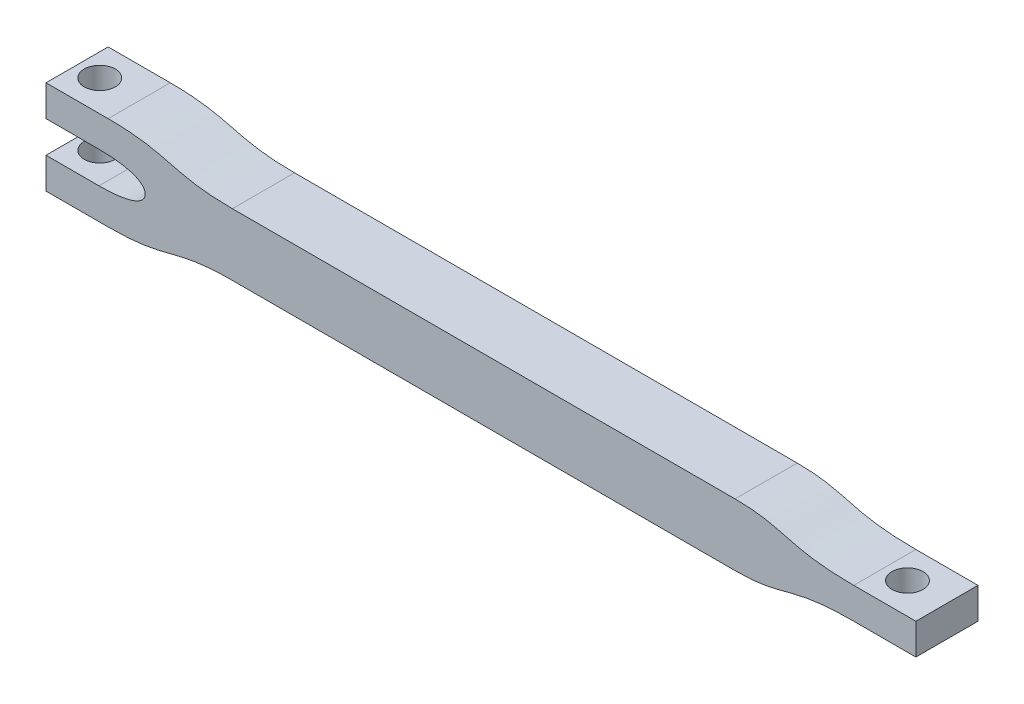
ISO-10303-21;
HEADER;
FILE_DESCRIPTION(('STEP AP214'),'2;1');
FILE_NAME('part.step','',(''),(''),'','','');
FILE_SCHEMA(('AUTOMOTIVE_DESIGN { 1 0 10303 214 1 1 1 1 }'));
ENDSEC;
DATA;
#1=APPLICATION_CONTEXT('core data for automotive mechanical design processes');
#2=APPLICATION_PROTOCOL_DEFINITION('international standard','automotive_design',2000,#1);
#3=PRODUCT_CONTEXT('',#1,'mechanical');
#4=PRODUCT('Part','Part','',(#3));
#5=PRODUCT_RELATED_PRODUCT_CATEGORY('part','',(#4));
#6=PRODUCT_DEFINITION_FORMATION('','',#4);
#7=PRODUCT_DEFINITION_CONTEXT('part definition',#1,'design');
#8=PRODUCT_DEFINITION('design','',#6,#7);
#9=PRODUCT_DEFINITION_SHAPE('','',#8);
#10=(LENGTH_UNIT() NAMED_UNIT(*) SI_UNIT(.MILLI.,.METRE.));
#11=(NAMED_UNIT(*) PLANE_ANGLE_UNIT() SI_UNIT($,.RADIAN.));
#12=(NAMED_UNIT(*) SI_UNIT($,.STERADIAN.) SOLID_ANGLE_UNIT());
#13=UNCERTAINTY_MEASURE_WITH_UNIT(LENGTH_MEASURE(1.E-05),#10,'distance_accuracy_value','');
#14=(GEOMETRIC_REPRESENTATION_CONTEXT(3) GLOBAL_UNCERTAINTY_ASSIGNED_CONTEXT((#13)) GLOBAL_UNIT_ASSIGNED_CONTEXT((#10,
#11,#12)) REPRESENTATION_CONTEXT('',''));
#15=CARTESIAN_POINT('',(0.,0.,0.));
#16=DIRECTION('',(0.,0.,1.));
#17=DIRECTION('',(1.,0.,0.));
#18=AXIS2_PLACEMENT_3D('',#15,#16,#17);
#19=CARTESIAN_POINT('',(63.5,12.7,25.4));
#20=CARTESIAN_POINT('',(38.1,12.7,25.4));
#21=CARTESIAN_POINT('',(38.1,19.177,25.4));
#22=CARTESIAN_POINT('',(12.7000000000001,19.177,25.4));
#23=B_SPLINE_CURVE_WITH_KNOTS('',3,(#19,#20,#21,#22),.UNSPECIFIED.,.F.,.F.,(4,4),(0.,1.),.UNSPECIFIED.);
#24=DIRECTION('',(0.,0.,-1.));
#25=VECTOR('',#24,1.);
#26=SURFACE_OF_LINEAR_EXTRUSION('',#23,#25);
#27=CARTESIAN_POINT('',(63.5,12.7,0.));
#28=CARTESIAN_POINT('',(38.1,12.7,0.));
#29=CARTESIAN_POINT('',(38.1,19.177,0.));
#30=CARTESIAN_POINT('',(12.7000000000001,19.177,0.));
#31=B_SPLINE_CURVE_WITH_KNOTS('',3,(#27,#28,#29,#30),.UNSPECIFIED.,.F.,.F.,(4,4),(0.,1.),.UNSPECIFIED.);
#32=CARTESIAN_POINT('',(63.5,12.7,0.));
#33=VERTEX_POINT('',#32);
#34=CARTESIAN_POINT('',(12.7000000000001,19.177,0.));
#35=VERTEX_POINT('',#34);
#36=EDGE_CURVE('E321',#33,#35,#31,.T.);
#37=ORIENTED_EDGE('',*,*,#36,.T.);
#38=DIRECTION('',(0.,0.,-1.));
#39=VECTOR('',#38,1.);
#40=CARTESIAN_POINT('',(12.7000000000001,19.177,25.4));
#41=LINE('',#40,#39);
#42=CARTESIAN_POINT('',(12.7000000000001,19.177,25.4));
#43=VERTEX_POINT('',#42);
#44=EDGE_CURVE('E11',#43,#35,#41,.T.);
#45=ORIENTED_EDGE('',*,*,#44,.F.);
#46=CARTESIAN_POINT('',(63.5,12.7,25.4));
#47=VERTEX_POINT('',#46);
#48=EDGE_CURVE('E272',#47,#43,#23,.T.);
#49=ORIENTED_EDGE('',*,*,#48,.F.);
#50=DIRECTION('',(0.,0.,-1.));
#51=VECTOR('',#50,1.);
#52=CARTESIAN_POINT('',(63.5,12.7,25.4));
#53=LINE('',#52,#51);
#54=EDGE_CURVE('E197',#47,#33,#53,.T.);
#55=ORIENTED_EDGE('',*,*,#54,.T.);
#56=EDGE_LOOP('',(#37,#45,#49,#55));
#57=FACE_BOUND('',#56,.T.);
#58=ADVANCED_FACE('F43',(#57),#26,.F.);
#59=CARTESIAN_POINT('',(12.7000000000001,19.177,25.4));
#60=DIRECTION('',(0.,-1.,0.));
#61=DIRECTION('',(1.,0.,0.));
#62=AXIS2_PLACEMENT_3D('',#59,#60,#61);
#63=PLANE('',#62);
#64=CARTESIAN_POINT('',(-3.42205149381981,19.177,12.6999999999999));
#65=DIRECTION('',(0.,-1.,0.));
#66=DIRECTION('',(-1.,0.,0.));
#67=AXIS2_PLACEMENT_3D('',#64,#65,#66);
#68=CIRCLE('',#67,6.35000000000027);
#69=CARTESIAN_POINT('',(-9.77205149382008,19.177,12.6999999999999));
#70=VERTEX_POINT('',#69);
#71=EDGE_CURVE('E342',#70,#70,#68,.T.);
#72=ORIENTED_EDGE('',*,*,#71,.T.);
#73=EDGE_LOOP('',(#72));
#74=FACE_BOUND('',#73,.T.);
#75=DIRECTION('',(-1.,0.,0.));
#76=VECTOR('',#75,1.);
#77=CARTESIAN_POINT('',(12.7000000000001,19.177,0.));
#78=LINE('',#77,#76);
#79=CARTESIAN_POINT('',(-12.6999999999999,19.177,0.));
#80=VERTEX_POINT('',#79);
#81=EDGE_CURVE('E318',#35,#80,#78,.T.);
#82=ORIENTED_EDGE('',*,*,#81,.T.);
#83=DIRECTION('',(0.,0.,-1.));
#84=VECTOR('',#83,1.);
#85=CARTESIAN_POINT('',(-12.6999999999999,19.177,25.4));
#86=LINE('',#85,#84);
#87=CARTESIAN_POINT('',(-12.6999999999999,19.177,25.4));
#88=VERTEX_POINT('',#87);
#89=EDGE_CURVE('E54',#88,#80,#86,.T.);
#90=ORIENTED_EDGE('',*,*,#89,.F.);
#91=DIRECTION('',(-1.,0.,0.));
#92=VECTOR('',#91,1.);
#93=CARTESIAN_POINT('',(12.7000000000001,19.177,25.4));
#94=LINE('',#93,#92);
#95=EDGE_CURVE('E130',#43,#88,#94,.T.);
#96=ORIENTED_EDGE('',*,*,#95,.F.);
#97=ORIENTED_EDGE('',*,*,#44,.T.);
#98=EDGE_LOOP('',(#82,#90,#96,#97));
#99=FACE_BOUND('',#98,.T.);
#100=ADVANCED_FACE('F377',(#74,#99),#63,.F.);
#101=CARTESIAN_POINT('',(-12.6999999999999,19.177,25.4));
#102=DIRECTION('',(1.,0.,0.));
#103=DIRECTION('',(0.,0.,-1.));
#104=AXIS2_PLACEMENT_3D('',#101,#102,#103);
#105=PLANE('',#104);
#106=DIRECTION('',(0.,-1.,0.));
#107=VECTOR('',#106,1.);
#108=CARTESIAN_POINT('',(-12.6999999999999,19.177,0.));
#109=LINE('',#108,#107);
#110=CARTESIAN_POINT('',(-12.6999999999999,6.477,0.));
#111=VERTEX_POINT('',#110);
#112=EDGE_CURVE('E315',#80,#111,#109,.T.);
#113=ORIENTED_EDGE('',*,*,#112,.T.);
#114=DIRECTION('',(0.,0.,-1.));
#115=VECTOR('',#114,1.);
#116=CARTESIAN_POINT('',(-12.6999999999999,6.477,25.4));
#117=LINE('',#116,#115);
#118=CARTESIAN_POINT('',(-12.6999999999999,6.477,25.4));
#119=VERTEX_POINT('',#118);
#120=EDGE_CURVE('E391',#119,#111,#117,.T.);
#121=ORIENTED_EDGE('',*,*,#120,.F.);
#122=DIRECTION('',(0.,-1.,0.));
#123=VECTOR('',#122,1.);
#124=CARTESIAN_POINT('',(-12.6999999999999,19.177,25.4));
#125=LINE('',#124,#123);
#126=EDGE_CURVE('E267',#88,#119,#125,.T.);
#127=ORIENTED_EDGE('',*,*,#126,.F.);
#128=ORIENTED_EDGE('',*,*,#89,.T.);
#129=EDGE_LOOP('',(#113,#121,#127,#128));
#130=FACE_BOUND('',#129,.T.);
#131=ADVANCED_FACE('F374',(#130),#105,.F.);
#132=CARTESIAN_POINT('',(-12.6999999999999,6.477,25.4));
#133=DIRECTION('',(0.,1.,0.));
#134=DIRECTION('',(-1.,0.,0.));
#135=AXIS2_PLACEMENT_3D('',#132,#133,#134);
#136=PLANE('',#135);
#137=CARTESIAN_POINT('',(-3.4220514938198,6.477,12.6999999999999));
#138=DIRECTION('',(0.,1.,0.));
#139=DIRECTION('',(-1.,0.,0.));
#140=AXIS2_PLACEMENT_3D('',#137,#138,#139);
#141=CIRCLE('',#140,6.35000000000027);
#142=CARTESIAN_POINT('',(-9.77205149382007,6.477,12.6999999999999));
#143=VERTEX_POINT('',#142);
#144=EDGE_CURVE('E325',#143,#143,#141,.T.);
#145=ORIENTED_EDGE('',*,*,#144,.T.);
#146=EDGE_LOOP('',(#145));
#147=FACE_BOUND('',#146,.T.);
#148=DIRECTION('',(1.,0.,0.));
#149=VECTOR('',#148,1.);
#150=CARTESIAN_POINT('',(-12.6999999999999,6.477,0.));
#151=LINE('',#150,#149);
#152=CARTESIAN_POINT('',(8.96412811261088,6.477,0.));
#153=VERTEX_POINT('',#152);
#154=EDGE_CURVE('E312',#111,#153,#151,.T.);
#155=ORIENTED_EDGE('',*,*,#154,.T.);
#156=DIRECTION('',(0.,0.,-1.));
#157=VECTOR('',#156,1.);
#158=CARTESIAN_POINT('',(8.96412811261088,6.477,25.4));
#159=LINE('',#158,#157);
#160=CARTESIAN_POINT('',(8.96412811261088,6.477,25.4));
#161=VERTEX_POINT('',#160);
#162=EDGE_CURVE('E401',#161,#153,#159,.T.);
#163=ORIENTED_EDGE('',*,*,#162,.F.);
#164=DIRECTION('',(1.,0.,0.));
#165=VECTOR('',#164,1.);
#166=CARTESIAN_POINT('',(-12.6999999999999,6.477,25.4));
#167=LINE('',#166,#165);
#168=EDGE_CURVE('E264',#119,#161,#167,.T.);
#169=ORIENTED_EDGE('',*,*,#168,.F.);
#170=ORIENTED_EDGE('',*,*,#120,.T.);
#171=EDGE_LOOP('',(#155,#163,#169,#170));
#172=FACE_BOUND('',#171,.T.);
#173=ADVANCED_FACE('F369',(#147,#172),#136,.F.);
#174=CARTESIAN_POINT('',(8.96412811261088,6.477,25.4));
#175=CARTESIAN_POINT('',(21.8133762562367,6.477,25.4));
#176=CARTESIAN_POINT('',(27.8400147660788,3.64867248716165,25.4));
#177=CARTESIAN_POINT('',(27.8400147660788,0.,25.4));
#178=B_SPLINE_CURVE_WITH_KNOTS('',3,(#174,#175,#176,#177),.UNSPECIFIED.,.F.,.F.,(4,4),(0.,1.),.UNSPECIFIED.);
#179=DIRECTION('',(0.,0.,-1.));
#180=VECTOR('',#179,1.);
#181=SURFACE_OF_LINEAR_EXTRUSION('',#178,#180);
#182=CARTESIAN_POINT('',(8.96412811261088,6.477,0.));
#183=CARTESIAN_POINT('',(21.8133762562367,6.477,0.));
#184=CARTESIAN_POINT('',(27.8400147660788,3.64867248716165,0.));
#185=CARTESIAN_POINT('',(27.8400147660788,0.,0.));
#186=B_SPLINE_CURVE_WITH_KNOTS('',3,(#182,#183,#184,#185),.UNSPECIFIED.,.F.,.F.,(4,4),(0.,1.),.UNSPECIFIED.);
#187=CARTESIAN_POINT('',(27.8400147660788,0.,0.));
#188=VERTEX_POINT('',#187);
#189=EDGE_CURVE('E309',#153,#188,#186,.T.);
#190=ORIENTED_EDGE('',*,*,#189,.T.);
#191=DIRECTION('',(0.,0.,-1.));
#192=VECTOR('',#191,1.);
#193=CARTESIAN_POINT('',(27.8400147660788,0.,25.4));
#194=LINE('',#193,#192);
#195=CARTESIAN_POINT('',(27.8400147660788,0.,25.4));
#196=VERTEX_POINT('',#195);
#197=EDGE_CURVE('E406',#196,#188,#194,.T.);
#198=ORIENTED_EDGE('',*,*,#197,.F.);
#199=EDGE_CURVE('E261',#161,#196,#178,.T.);
#200=ORIENTED_EDGE('',*,*,#199,.F.);
#201=ORIENTED_EDGE('',*,*,#162,.T.);
#202=EDGE_LOOP('',(#190,#198,#200,#201));
#203=FACE_BOUND('',#202,.T.);
#204=ADVANCED_FACE('F364',(#203),#181,.F.);
#205=CARTESIAN_POINT('',(27.8400147660788,0.,25.4));
#206=CARTESIAN_POINT('',(27.8400147660788,-3.64867248716165,25.4));
#207=CARTESIAN_POINT('',(21.8133762562367,-6.477,25.4));
#208=CARTESIAN_POINT('',(8.96412811261088,-6.477,25.4));
#209=B_SPLINE_CURVE_WITH_KNOTS('',3,(#205,#206,#207,#208),.UNSPECIFIED.,.F.,.F.,(4,4),(0.,1.),.UNSPECIFIED.);
#210=DIRECTION('',(0.,0.,-1.));
#211=VECTOR('',#210,1.);
#212=SURFACE_OF_LINEAR_EXTRUSION('',#209,#211);
#213=CARTESIAN_POINT('',(27.8400147660788,0.,0.));
#214=CARTESIAN_POINT('',(27.8400147660788,-3.64867248716165,0.));
#215=CARTESIAN_POINT('',(21.8133762562367,-6.477,0.));
#216=CARTESIAN_POINT('',(8.96412811261088,-6.477,0.));
#217=B_SPLINE_CURVE_WITH_KNOTS('',3,(#213,#214,#215,#216),.UNSPECIFIED.,.F.,.F.,(4,4),(0.,1.),.UNSPECIFIED.);
#218=CARTESIAN_POINT('',(8.96412811261088,-6.477,0.));
#219=VERTEX_POINT('',#218);
#220=EDGE_CURVE('E306',#188,#219,#217,.T.);
#221=ORIENTED_EDGE('',*,*,#220,.T.);
#222=DIRECTION('',(0.,0.,-1.));
#223=VECTOR('',#222,1.);
#224=CARTESIAN_POINT('',(8.96412811261088,-6.477,25.4));
#225=LINE('',#224,#223);
#226=CARTESIAN_POINT('',(8.96412811261088,-6.477,25.4));
#227=VERTEX_POINT('',#226);
#228=EDGE_CURVE('E411',#227,#219,#225,.T.);
#229=ORIENTED_EDGE('',*,*,#228,.F.);
#230=EDGE_CURVE('E258',#196,#227,#209,.T.);
#231=ORIENTED_EDGE('',*,*,#230,.F.);
#232=ORIENTED_EDGE('',*,*,#197,.T.);
#233=EDGE_LOOP('',(#221,#229,#231,#232));
#234=FACE_BOUND('',#233,.T.);
#235=ADVANCED_FACE('F368',(#234),#212,.F.);
#236=CARTESIAN_POINT('',(-12.6999999999999,-6.477,25.4));
#237=DIRECTION('',(0.,-1.,0.));
#238=DIRECTION('',(1.,0.,0.));
#239=AXIS2_PLACEMENT_3D('',#236,#237,#238);
#240=PLANE('',#239);
#241=CARTESIAN_POINT('',(-3.4220514938198,-6.477,12.6999999999999));
#242=DIRECTION('',(0.,-1.,0.));
#243=DIRECTION('',(1.,0.,0.));
#244=AXIS2_PLACEMENT_3D('',#241,#242,#243);
#245=CIRCLE('',#244,6.35000000000027);
#246=CARTESIAN_POINT('',(2.92794850618047,-6.477,12.6999999999999));
#247=VERTEX_POINT('',#246);
#248=EDGE_CURVE('E328',#247,#247,#245,.T.);
#249=ORIENTED_EDGE('',*,*,#248,.T.);
#250=EDGE_LOOP('',(#249));
#251=FACE_BOUND('',#250,.T.);
#252=DIRECTION('',(-1.,0.,0.));
#253=VECTOR('',#252,1.);
#254=CARTESIAN_POINT('',(-12.6999999999999,-6.477,0.));
#255=LINE('',#254,#253);
#256=CARTESIAN_POINT('',(-12.6999999999999,-6.477,0.));
#257=VERTEX_POINT('',#256);
#258=EDGE_CURVE('E303',#219,#257,#255,.T.);
#259=ORIENTED_EDGE('',*,*,#258,.T.);
#260=DIRECTION('',(0.,0.,-1.));
#261=VECTOR('',#260,1.);
#262=CARTESIAN_POINT('',(-12.6999999999999,-6.477,25.4));
#263=LINE('',#262,#261);
#264=CARTESIAN_POINT('',(-12.6999999999999,-6.477,25.4));
#265=VERTEX_POINT('',#264);
#266=EDGE_CURVE('E417',#265,#257,#263,.T.);
#267=ORIENTED_EDGE('',*,*,#266,.F.);
#268=DIRECTION('',(-1.,0.,0.));
#269=VECTOR('',#268,1.);
#270=CARTESIAN_POINT('',(-12.6999999999999,-6.477,25.4));
#271=LINE('',#270,#269);
#272=EDGE_CURVE('E255',#227,#265,#271,.T.);
#273=ORIENTED_EDGE('',*,*,#272,.F.);
#274=ORIENTED_EDGE('',*,*,#228,.T.);
#275=EDGE_LOOP('',(#259,#267,#273,#274));
#276=FACE_BOUND('',#275,.T.);
#277=ADVANCED_FACE('F535',(#251,#276),#240,.F.);
#278=CARTESIAN_POINT('',(-12.6999999999999,-19.177,25.4));
#279=DIRECTION('',(1.,0.,0.));
#280=DIRECTION('',(0.,0.,-1.));
#281=AXIS2_PLACEMENT_3D('',#278,#279,#280);
#282=PLANE('',#281);
#283=DIRECTION('',(0.,-1.,0.));
#284=VECTOR('',#283,1.);
#285=CARTESIAN_POINT('',(-12.6999999999999,-19.177,0.));
#286=LINE('',#285,#284);
#287=CARTESIAN_POINT('',(-12.6999999999999,-19.177,0.));
#288=VERTEX_POINT('',#287);
#289=EDGE_CURVE('E300',#257,#288,#286,.T.);
#290=ORIENTED_EDGE('',*,*,#289,.T.);
#291=DIRECTION('',(0.,0.,-1.));
#292=VECTOR('',#291,1.);
#293=CARTESIAN_POINT('',(-12.6999999999999,-19.177,25.4));
#294=LINE('',#293,#292);
#295=CARTESIAN_POINT('',(-12.6999999999999,-19.177,25.4));
#296=VERTEX_POINT('',#295);
#297=EDGE_CURVE('E421',#296,#288,#294,.T.);
#298=ORIENTED_EDGE('',*,*,#297,.F.);
#299=DIRECTION('',(0.,-1.,0.));
#300=VECTOR('',#299,1.);
#301=CARTESIAN_POINT('',(-12.6999999999999,-19.177,25.4));
#302=LINE('',#301,#300);
#303=EDGE_CURVE('E252',#265,#296,#302,.T.);
#304=ORIENTED_EDGE('',*,*,#303,.F.);
#305=ORIENTED_EDGE('',*,*,#266,.T.);
#306=EDGE_LOOP('',(#290,#298,#304,#305));
#307=FACE_BOUND('',#306,.T.);
#308=ADVANCED_FACE('F531',(#307),#282,.F.);
#309=CARTESIAN_POINT('',(12.7000000000001,-19.177,25.4));
#310=DIRECTION('',(0.,1.,0.));
#311=DIRECTION('',(-1.,0.,0.));
#312=AXIS2_PLACEMENT_3D('',#309,#310,#311);
#313=PLANE('',#312);
#314=CARTESIAN_POINT('',(-3.4220514938198,-19.177,12.6999999999999));
#315=DIRECTION('',(0.,-1.,0.));
#316=DIRECTION('',(-1.,0.,0.));
#317=AXIS2_PLACEMENT_3D('',#314,#315,#316);
#318=CIRCLE('',#317,6.35000000000027);
#319=CARTESIAN_POINT('',(-9.77205149382007,-19.177,12.6999999999999));
#320=VERTEX_POINT('',#319);
#321=EDGE_CURVE('E339',#320,#320,#318,.T.);
#322=ORIENTED_EDGE('',*,*,#321,.F.);
#323=EDGE_LOOP('',(#322));
#324=FACE_BOUND('',#323,.T.);
#325=DIRECTION('',(1.,0.,0.));
#326=VECTOR('',#325,1.);
#327=CARTESIAN_POINT('',(12.7000000000001,-19.177,0.));
#328=LINE('',#327,#326);
#329=CARTESIAN_POINT('',(12.7000000000001,-19.177,0.));
#330=VERTEX_POINT('',#329);
#331=EDGE_CURVE('E297',#288,#330,#328,.T.);
#332=ORIENTED_EDGE('',*,*,#331,.T.);
#333=DIRECTION('',(0.,0.,-1.));
#334=VECTOR('',#333,1.);
#335=CARTESIAN_POINT('',(12.7000000000001,-19.177,25.4));
#336=LINE('',#335,#334);
#337=CARTESIAN_POINT('',(12.7000000000001,-19.177,25.4));
#338=VERTEX_POINT('',#337);
#339=EDGE_CURVE('E425',#338,#330,#336,.T.);
#340=ORIENTED_EDGE('',*,*,#339,.F.);
#341=DIRECTION('',(1.,0.,0.));
#342=VECTOR('',#341,1.);
#343=CARTESIAN_POINT('',(12.7000000000001,-19.177,25.4));
#344=LINE('',#343,#342);
#345=EDGE_CURVE('E250',#296,#338,#344,.T.);
#346=ORIENTED_EDGE('',*,*,#345,.F.);
#347=ORIENTED_EDGE('',*,*,#297,.T.);
#348=EDGE_LOOP('',(#332,#340,#346,#347));
#349=FACE_BOUND('',#348,.T.);
#350=ADVANCED_FACE('F526',(#324,#349),#313,.F.);
#351=CARTESIAN_POINT('',(12.7000000000001,-19.177,25.4));
#352=CARTESIAN_POINT('',(38.1,-19.177,25.4));
#353=CARTESIAN_POINT('',(38.1,-12.7,25.4));
#354=CARTESIAN_POINT('',(63.5,-12.7,25.4));
#355=B_SPLINE_CURVE_WITH_KNOTS('',3,(#351,#352,#353,#354),.UNSPECIFIED.,.F.,.F.,(4,4),(0.,1.),.UNSPECIFIED.);
#356=DIRECTION('',(0.,0.,-1.));
#357=VECTOR('',#356,1.);
#358=SURFACE_OF_LINEAR_EXTRUSION('',#355,#357);
#359=CARTESIAN_POINT('',(12.7000000000001,-19.177,0.));
#360=CARTESIAN_POINT('',(38.1,-19.177,0.));
#361=CARTESIAN_POINT('',(38.1,-12.7,0.));
#362=CARTESIAN_POINT('',(63.5,-12.7,0.));
#363=B_SPLINE_CURVE_WITH_KNOTS('',3,(#359,#360,#361,#362),.UNSPECIFIED.,.F.,.F.,(4,4),(0.,1.),.UNSPECIFIED.);
#364=CARTESIAN_POINT('',(63.5,-12.7,0.));
#365=VERTEX_POINT('',#364);
#366=EDGE_CURVE('E293',#330,#365,#363,.T.);
#367=ORIENTED_EDGE('',*,*,#366,.T.);
#368=DIRECTION('',(0.,0.,-1.));
#369=VECTOR('',#368,1.);
#370=CARTESIAN_POINT('',(63.5,-12.7,25.4));
#371=LINE('',#370,#369);
#372=CARTESIAN_POINT('',(63.5,-12.7,25.4));
#373=VERTEX_POINT('',#372);
#374=EDGE_CURVE('E429',#373,#365,#371,.T.);
#375=ORIENTED_EDGE('',*,*,#374,.F.);
#376=EDGE_CURVE('E248',#338,#373,#355,.T.);
#377=ORIENTED_EDGE('',*,*,#376,.F.);
#378=ORIENTED_EDGE('',*,*,#339,.T.);
#379=EDGE_LOOP('',(#367,#375,#377,#378));
#380=FACE_BOUND('',#379,.T.);
#381=ADVANCED_FACE('F520',(#380),#358,.F.);
#382=CARTESIAN_POINT('',(165.1,-12.7,25.4));
#383=DIRECTION('',(0.,1.,0.));
#384=DIRECTION('',(0.,0.,1.));
#385=AXIS2_PLACEMENT_3D('',#382,#383,#384);
#386=PLANE('',#385);
#387=DIRECTION('',(1.,0.,0.));
#388=VECTOR('',#387,1.);
#389=CARTESIAN_POINT('',(165.1,-12.7,0.));
#390=LINE('',#389,#388);
#391=CARTESIAN_POINT('',(268.992389609526,-12.7,0.));
#392=VERTEX_POINT('',#391);
#393=EDGE_CURVE('E290',#365,#392,#390,.T.);
#394=ORIENTED_EDGE('',*,*,#393,.T.);
#395=DIRECTION('',(0.,0.,-1.));
#396=VECTOR('',#395,1.);
#397=CARTESIAN_POINT('',(268.992389609526,-12.7,25.4));
#398=LINE('',#397,#396);
#399=CARTESIAN_POINT('',(268.992389609526,-12.7,25.4));
#400=VERTEX_POINT('',#399);
#401=EDGE_CURVE('E433',#400,#392,#398,.T.);
#402=ORIENTED_EDGE('',*,*,#401,.F.);
#403=DIRECTION('',(1.,0.,0.));
#404=VECTOR('',#403,1.);
#405=CARTESIAN_POINT('',(165.1,-12.7,25.4));
#406=LINE('',#405,#404);
#407=EDGE_CURVE('E239',#373,#400,#406,.T.);
#408=ORIENTED_EDGE('',*,*,#407,.F.);
#409=ORIENTED_EDGE('',*,*,#374,.T.);
#410=EDGE_LOOP('',(#394,#402,#408,#409));
#411=FACE_BOUND('',#410,.T.);
#412=ADVANCED_FACE('F228',(#411),#386,.F.);
#413=CARTESIAN_POINT('',(268.992389609526,-12.7,25.4));
#414=CARTESIAN_POINT('',(289.837979728263,-12.7,25.4));
#415=CARTESIAN_POINT('',(289.837979728263,-6.35,25.4));
#416=CARTESIAN_POINT('',(317.5,-6.35,25.4));
#417=B_SPLINE_CURVE_WITH_KNOTS('',3,(#413,#414,#415,#416),.UNSPECIFIED.,.F.,.F.,(4,4),(0.,1.),.UNSPECIFIED.);
#418=DIRECTION('',(0.,0.,-1.));
#419=VECTOR('',#418,1.);
#420=SURFACE_OF_LINEAR_EXTRUSION('',#417,#419);
#421=CARTESIAN_POINT('',(268.992389609526,-12.7,0.));
#422=CARTESIAN_POINT('',(289.837979728263,-12.7,0.));
#423=CARTESIAN_POINT('',(289.837979728263,-6.35,0.));
#424=CARTESIAN_POINT('',(317.5,-6.35,0.));
#425=B_SPLINE_CURVE_WITH_KNOTS('',3,(#421,#422,#423,#424),.UNSPECIFIED.,.F.,.F.,(4,4),(0.,1.),.UNSPECIFIED.);
#426=CARTESIAN_POINT('',(317.5,-6.35,0.));
#427=VERTEX_POINT('',#426);
#428=EDGE_CURVE('E287',#392,#427,#425,.T.);
#429=ORIENTED_EDGE('',*,*,#428,.T.);
#430=DIRECTION('',(0.,0.,-1.));
#431=VECTOR('',#430,1.);
#432=CARTESIAN_POINT('',(317.5,-6.35,25.4));
#433=LINE('',#432,#431);
#434=CARTESIAN_POINT('',(317.5,-6.35,25.4));
#435=VERTEX_POINT('',#434);
#436=EDGE_CURVE('E437',#435,#427,#433,.T.);
#437=ORIENTED_EDGE('',*,*,#436,.F.);
#438=EDGE_CURVE('E231',#400,#435,#417,.T.);
#439=ORIENTED_EDGE('',*,*,#438,.F.);
#440=ORIENTED_EDGE('',*,*,#401,.T.);
#441=EDGE_LOOP('',(#429,#437,#439,#440));
#442=FACE_BOUND('',#441,.T.);
#443=ADVANCED_FACE('F223',(#442),#420,.F.);
#444=CARTESIAN_POINT('',(317.5,-6.35,25.4));
#445=DIRECTION('',(0.,1.,0.));
#446=DIRECTION('',(0.,0.,1.));
#447=AXIS2_PLACEMENT_3D('',#444,#445,#446);
#448=PLANE('',#447);
#449=CARTESIAN_POINT('',(326.77794850618,-6.35,12.7));
#450=DIRECTION('',(0.,1.,0.));
#451=DIRECTION('',(0.,0.,1.));
#452=AXIS2_PLACEMENT_3D('',#449,#450,#451);
#453=CIRCLE('',#452,6.35);
#454=CARTESIAN_POINT('',(326.77794850618,-6.35,19.05));
#455=VERTEX_POINT('',#454);
#456=EDGE_CURVE('E332',#455,#455,#453,.T.);
#457=ORIENTED_EDGE('',*,*,#456,.T.);
#458=EDGE_LOOP('',(#457));
#459=FACE_BOUND('',#458,.T.);
#460=DIRECTION('',(1.,0.,0.));
#461=VECTOR('',#460,1.);
#462=CARTESIAN_POINT('',(317.5,-6.35,0.));
#463=LINE('',#462,#461);
#464=CARTESIAN_POINT('',(342.9,-6.35,0.));
#465=VERTEX_POINT('',#464);
#466=EDGE_CURVE('E284',#427,#465,#463,.T.);
#467=ORIENTED_EDGE('',*,*,#466,.T.);
#468=DIRECTION('',(0.,0.,-1.));
#469=VECTOR('',#468,1.);
#470=CARTESIAN_POINT('',(342.9,-6.35,25.4));
#471=LINE('',#470,#469);
#472=CARTESIAN_POINT('',(342.9,-6.35,25.4));
#473=VERTEX_POINT('',#472);
#474=EDGE_CURVE('E441',#473,#465,#471,.T.);
#475=ORIENTED_EDGE('',*,*,#474,.F.);
#476=DIRECTION('',(1.,0.,0.));
#477=VECTOR('',#476,1.);
#478=CARTESIAN_POINT('',(317.5,-6.35,25.4));
#479=LINE('',#478,#477);
#480=EDGE_CURVE('E238',#435,#473,#479,.T.);
#481=ORIENTED_EDGE('',*,*,#480,.F.);
#482=ORIENTED_EDGE('',*,*,#436,.T.);
#483=EDGE_LOOP('',(#467,#475,#481,#482));
#484=FACE_BOUND('',#483,.T.);
#485=ADVANCED_FACE('F219',(#459,#484),#448,.F.);
#486=CARTESIAN_POINT('',(342.9,-6.35,25.4));
#487=DIRECTION('',(-1.,0.,0.));
#488=DIRECTION('',(0.,0.,1.));
#489=AXIS2_PLACEMENT_3D('',#486,#487,#488);
#490=PLANE('',#489);
#491=DIRECTION('',(0.,1.,0.));
#492=VECTOR('',#491,1.);
#493=CARTESIAN_POINT('',(342.9,-6.35,0.));
#494=LINE('',#493,#492);
#495=CARTESIAN_POINT('',(342.9,6.35,0.));
#496=VERTEX_POINT('',#495);
#497=EDGE_CURVE('E281',#465,#496,#494,.T.);
#498=ORIENTED_EDGE('',*,*,#497,.T.);
#499=DIRECTION('',(0.,0.,-1.));
#500=VECTOR('',#499,1.);
#501=CARTESIAN_POINT('',(342.9,6.35,25.4));
#502=LINE('',#501,#500);
#503=CARTESIAN_POINT('',(342.9,6.35,25.4));
#504=VERTEX_POINT('',#503);
#505=EDGE_CURVE('E190',#504,#496,#502,.T.);
#506=ORIENTED_EDGE('',*,*,#505,.F.);
#507=DIRECTION('',(0.,1.,0.));
#508=VECTOR('',#507,1.);
#509=CARTESIAN_POINT('',(342.9,-6.35,25.4));
#510=LINE('',#509,#508);
#511=EDGE_CURVE('E177',#473,#504,#510,.T.);
#512=ORIENTED_EDGE('',*,*,#511,.F.);
#513=ORIENTED_EDGE('',*,*,#474,.T.);
#514=EDGE_LOOP('',(#498,#506,#512,#513));
#515=FACE_BOUND('',#514,.T.);
#516=ADVANCED_FACE('F215',(#515),#490,.F.);
#517=CARTESIAN_POINT('',(317.5,6.35,25.4));
#518=DIRECTION('',(0.,-1.,0.));
#519=DIRECTION('',(0.,0.,-1.));
#520=AXIS2_PLACEMENT_3D('',#517,#518,#519);
#521=PLANE('',#520);
#522=CARTESIAN_POINT('',(326.77794850618,6.35,12.7));
#523=DIRECTION('',(0.,-1.,0.));
#524=DIRECTION('',(0.,0.,-1.));
#525=AXIS2_PLACEMENT_3D('',#522,#523,#524);
#526=CIRCLE('',#525,6.35);
#527=CARTESIAN_POINT('',(326.77794850618,6.35,6.35000000000002));
#528=VERTEX_POINT('',#527);
#529=EDGE_CURVE('E47',#528,#528,#526,.T.);
#530=ORIENTED_EDGE('',*,*,#529,.T.);
#531=EDGE_LOOP('',(#530));
#532=FACE_BOUND('',#531,.T.);
#533=DIRECTION('',(-1.,0.,0.));
#534=VECTOR('',#533,1.);
#535=CARTESIAN_POINT('',(317.5,6.35,0.));
#536=LINE('',#535,#534);
#537=CARTESIAN_POINT('',(317.5,6.35,0.));
#538=VERTEX_POINT('',#537);
#539=EDGE_CURVE('E187',#496,#538,#536,.T.);
#540=ORIENTED_EDGE('',*,*,#539,.T.);
#541=DIRECTION('',(0.,0.,-1.));
#542=VECTOR('',#541,1.);
#543=CARTESIAN_POINT('',(317.5,6.35,25.4));
#544=LINE('',#543,#542);
#545=CARTESIAN_POINT('',(317.5,6.35,25.4));
#546=VERTEX_POINT('',#545);
#547=EDGE_CURVE('E184',#546,#538,#544,.T.);
#548=ORIENTED_EDGE('',*,*,#547,.F.);
#549=DIRECTION('',(-1.,0.,0.));
#550=VECTOR('',#549,1.);
#551=CARTESIAN_POINT('',(317.5,6.35,25.4));
#552=LINE('',#551,#550);
#553=EDGE_CURVE('E170',#504,#546,#552,.T.);
#554=ORIENTED_EDGE('',*,*,#553,.F.);
#555=ORIENTED_EDGE('',*,*,#505,.T.);
#556=EDGE_LOOP('',(#540,#548,#554,#555));
#557=FACE_BOUND('',#556,.T.);
#558=ADVANCED_FACE('F185',(#532,#557),#521,.F.);
#559=CARTESIAN_POINT('',(317.5,6.35,25.4));
#560=CARTESIAN_POINT('',(289.837979728263,6.35,25.4));
#561=CARTESIAN_POINT('',(289.837979728263,12.7,25.4));
#562=CARTESIAN_POINT('',(268.992389609526,12.7,25.4));
#563=B_SPLINE_CURVE_WITH_KNOTS('',3,(#559,#560,#561,#562),.UNSPECIFIED.,.F.,.F.,(4,4),(0.,1.),.UNSPECIFIED.);
#564=DIRECTION('',(0.,0.,-1.));
#565=VECTOR('',#564,1.);
#566=SURFACE_OF_LINEAR_EXTRUSION('',#563,#565);
#567=CARTESIAN_POINT('',(317.5,6.35,0.));
#568=CARTESIAN_POINT('',(289.837979728263,6.35,0.));
#569=CARTESIAN_POINT('',(289.837979728263,12.7,0.));
#570=CARTESIAN_POINT('',(268.992389609526,12.7,0.));
#571=B_SPLINE_CURVE_WITH_KNOTS('',3,(#567,#568,#569,#570),.UNSPECIFIED.,.F.,.F.,(4,4),(0.,1.),.UNSPECIFIED.);
#572=CARTESIAN_POINT('',(268.992389609526,12.7,0.));
#573=VERTEX_POINT('',#572);
#574=EDGE_CURVE('E276',#538,#573,#571,.T.);
#575=ORIENTED_EDGE('',*,*,#574,.T.);
#576=DIRECTION('',(0.,0.,-1.));
#577=VECTOR('',#576,1.);
#578=CARTESIAN_POINT('',(268.992389609526,12.7,25.4));
#579=LINE('',#578,#577);
#580=CARTESIAN_POINT('',(268.992389609526,12.7,25.4));
#581=VERTEX_POINT('',#580);
#582=EDGE_CURVE('E191',#581,#573,#579,.T.);
#583=ORIENTED_EDGE('',*,*,#582,.F.);
#584=EDGE_CURVE('E174',#546,#581,#563,.T.);
#585=ORIENTED_EDGE('',*,*,#584,.F.);
#586=ORIENTED_EDGE('',*,*,#547,.T.);
#587=EDGE_LOOP('',(#575,#583,#585,#586));
#588=FACE_BOUND('',#587,.T.);
#589=ADVANCED_FACE('F193',(#588),#566,.F.);
#590=CARTESIAN_POINT('',(165.1,12.7,25.4));
#591=DIRECTION('',(0.,-1.,0.));
#592=DIRECTION('',(1.,0.,0.));
#593=AXIS2_PLACEMENT_3D('',#590,#591,#592);
#594=PLANE('',#593);
#595=DIRECTION('',(-1.,0.,0.));
#596=VECTOR('',#595,1.);
#597=CARTESIAN_POINT('',(165.1,12.7,0.));
#598=LINE('',#597,#596);
#599=EDGE_CURVE('E118',#573,#33,#598,.T.);
#600=ORIENTED_EDGE('',*,*,#599,.T.);
#601=ORIENTED_EDGE('',*,*,#54,.F.);
#602=DIRECTION('',(-1.,0.,0.));
#603=VECTOR('',#602,1.);
#604=CARTESIAN_POINT('',(165.1,12.7,25.4));
#605=LINE('',#604,#603);
#606=EDGE_CURVE('E62',#581,#47,#605,.T.);
#607=ORIENTED_EDGE('',*,*,#606,.F.);
#608=ORIENTED_EDGE('',*,*,#582,.T.);
#609=EDGE_LOOP('',(#600,#601,#607,#608));
#610=FACE_BOUND('',#609,.T.);
#611=ADVANCED_FACE('F211',(#610),#594,.F.);
#612=CARTESIAN_POINT('',(38.1,15.9385,25.4));
#613=DIRECTION('',(0.,0.,1.));
#614=DIRECTION('',(1.,0.,0.));
#615=AXIS2_PLACEMENT_3D('',#612,#613,#614);
#616=PLANE('',#615);
#617=ORIENTED_EDGE('',*,*,#48,.T.);
#618=ORIENTED_EDGE('',*,*,#95,.T.);
#619=ORIENTED_EDGE('',*,*,#126,.T.);
#620=ORIENTED_EDGE('',*,*,#168,.T.);
#621=ORIENTED_EDGE('',*,*,#199,.T.);
#622=ORIENTED_EDGE('',*,*,#230,.T.);
#623=ORIENTED_EDGE('',*,*,#272,.T.);
#624=ORIENTED_EDGE('',*,*,#303,.T.);
#625=ORIENTED_EDGE('',*,*,#345,.T.);
#626=ORIENTED_EDGE('',*,*,#376,.T.);
#627=ORIENTED_EDGE('',*,*,#407,.T.);
#628=ORIENTED_EDGE('',*,*,#438,.T.);
#629=ORIENTED_EDGE('',*,*,#480,.T.);
#630=ORIENTED_EDGE('',*,*,#511,.T.);
#631=ORIENTED_EDGE('',*,*,#553,.T.);
#632=ORIENTED_EDGE('',*,*,#584,.T.);
#633=ORIENTED_EDGE('',*,*,#606,.T.);
#634=EDGE_LOOP('',(#617,#618,#619,#620,#621,#622,#623,#624,#625,#626,#627,#628,#629,#630,#631,
#632,#633));
#635=FACE_BOUND('',#634,.T.);
#636=ADVANCED_FACE('F172',(#635),#616,.T.);
#637=CARTESIAN_POINT('',(38.1,15.9385,0.));
#638=DIRECTION('',(0.,0.,1.));
#639=DIRECTION('',(1.,0.,0.));
#640=AXIS2_PLACEMENT_3D('',#637,#638,#639);
#641=PLANE('',#640);
#642=ORIENTED_EDGE('',*,*,#36,.F.);
#643=ORIENTED_EDGE('',*,*,#599,.F.);
#644=ORIENTED_EDGE('',*,*,#574,.F.);
#645=ORIENTED_EDGE('',*,*,#539,.F.);
#646=ORIENTED_EDGE('',*,*,#497,.F.);
#647=ORIENTED_EDGE('',*,*,#466,.F.);
#648=ORIENTED_EDGE('',*,*,#428,.F.);
#649=ORIENTED_EDGE('',*,*,#393,.F.);
#650=ORIENTED_EDGE('',*,*,#366,.F.);
#651=ORIENTED_EDGE('',*,*,#331,.F.);
#652=ORIENTED_EDGE('',*,*,#289,.F.);
#653=ORIENTED_EDGE('',*,*,#258,.F.);
#654=ORIENTED_EDGE('',*,*,#220,.F.);
#655=ORIENTED_EDGE('',*,*,#189,.F.);
#656=ORIENTED_EDGE('',*,*,#154,.F.);
#657=ORIENTED_EDGE('',*,*,#112,.F.);
#658=ORIENTED_EDGE('',*,*,#81,.F.);
#659=EDGE_LOOP('',(#642,#643,#644,#645,#646,#647,#648,#649,#650,#651,#652,#653,#654,#655,#656,
#657,#658));
#660=FACE_BOUND('',#659,.T.);
#661=ADVANCED_FACE('F394',(#660),#641,.F.);
#662=CARTESIAN_POINT('',(326.77794850618,19.1770000000001,12.7));
#663=DIRECTION('',(0.,-1.,0.));
#664=DIRECTION('',(1.,0.,0.));
#665=AXIS2_PLACEMENT_3D('',#662,#663,#664);
#666=CYLINDRICAL_SURFACE('',#665,6.35);
#667=ORIENTED_EDGE('',*,*,#529,.F.);
#668=EDGE_LOOP('',(#667));
#669=FACE_BOUND('',#668,.T.);
#670=ORIENTED_EDGE('',*,*,#456,.F.);
#671=EDGE_LOOP('',(#670));
#672=FACE_BOUND('',#671,.T.);
#673=ADVANCED_FACE('F489',(#669,#672),#666,.F.);
#674=CARTESIAN_POINT('',(-3.42205149381981,19.177,12.6999999999999));
#675=DIRECTION('',(0.,-1.,0.));
#676=DIRECTION('',(1.,0.,0.));
#677=AXIS2_PLACEMENT_3D('',#674,#675,#676);
#678=CYLINDRICAL_SURFACE('',#677,6.35000000000027);
#679=ORIENTED_EDGE('',*,*,#321,.T.);
#680=EDGE_LOOP('',(#679));
#681=FACE_BOUND('',#680,.T.);
#682=ORIENTED_EDGE('',*,*,#248,.F.);
#683=EDGE_LOOP('',(#682));
#684=FACE_BOUND('',#683,.T.);
#685=ADVANCED_FACE('F494',(#681,#684),#678,.F.);
#686=ORIENTED_EDGE('',*,*,#71,.F.);
#687=EDGE_LOOP('',(#686));
#688=FACE_BOUND('',#687,.T.);
#689=ORIENTED_EDGE('',*,*,#144,.F.);
#690=EDGE_LOOP('',(#689));
#691=FACE_BOUND('',#690,.T.);
#692=ADVANCED_FACE('F491',(#688,#691),#678,.F.);
#693=CLOSED_SHELL('',(#58,#100,#131,#173,#204,#235,#277,#308,#350,#381,#412,#443,#485,#516,#558,
#589,#611,#636,#661,#673,#685,#692));
#694=MANIFOLD_SOLID_BREP('B2',#693);
#695=ADVANCED_BREP_SHAPE_REPRESENTATION('',(#18,#694),#14);
#696=SHAPE_DEFINITION_REPRESENTATION(#9,#695);
ENDSEC;
END-ISO-10303-21;
